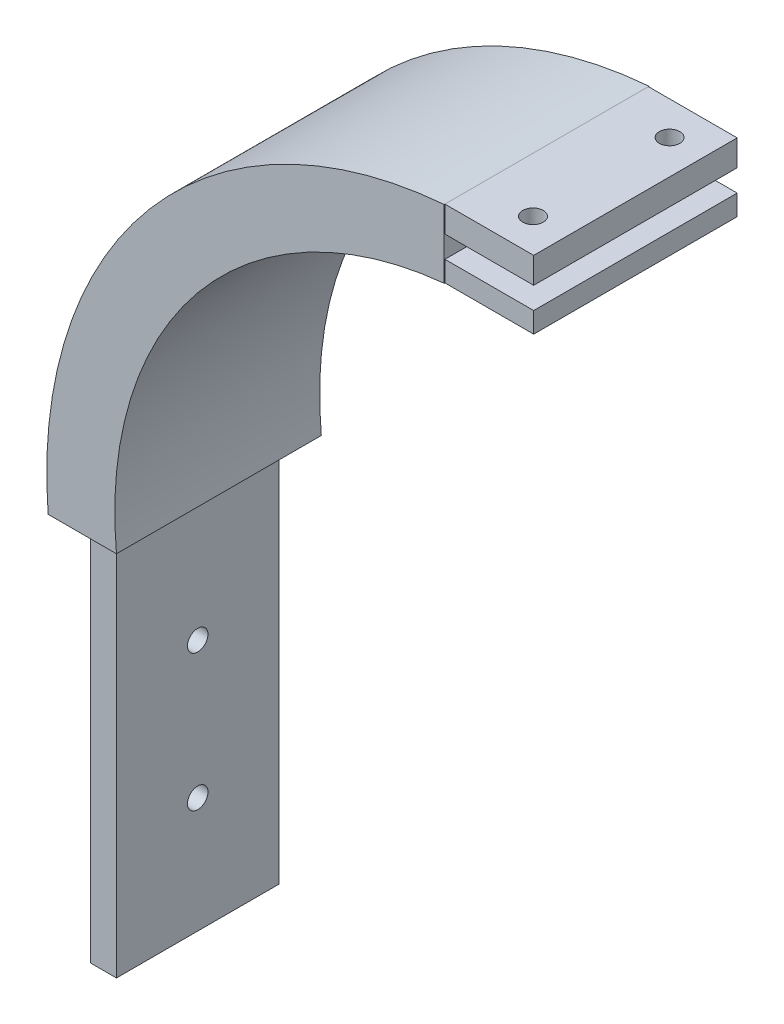
ISO-10303-21;
HEADER;
FILE_DESCRIPTION(('STEP AP214'),'2;1');
FILE_NAME('part.step','',(''),(''),'','','');
FILE_SCHEMA(('AUTOMOTIVE_DESIGN { 1 0 10303 214 1 1 1 1 }'));
ENDSEC;
DATA;
#1=APPLICATION_CONTEXT('core data for automotive mechanical design processes');
#2=APPLICATION_PROTOCOL_DEFINITION('international standard','automotive_design',2000,#1);
#3=PRODUCT_CONTEXT('',#1,'mechanical');
#4=PRODUCT('Part','Part','',(#3));
#5=PRODUCT_RELATED_PRODUCT_CATEGORY('part','',(#4));
#6=PRODUCT_DEFINITION_FORMATION('','',#4);
#7=PRODUCT_DEFINITION_CONTEXT('part definition',#1,'design');
#8=PRODUCT_DEFINITION('design','',#6,#7);
#9=PRODUCT_DEFINITION_SHAPE('','',#8);
#10=(LENGTH_UNIT() NAMED_UNIT(*) SI_UNIT(.MILLI.,.METRE.));
#11=(NAMED_UNIT(*) PLANE_ANGLE_UNIT() SI_UNIT($,.RADIAN.));
#12=(NAMED_UNIT(*) SI_UNIT($,.STERADIAN.) SOLID_ANGLE_UNIT());
#13=UNCERTAINTY_MEASURE_WITH_UNIT(LENGTH_MEASURE(1.E-05),#10,'distance_accuracy_value','');
#14=(GEOMETRIC_REPRESENTATION_CONTEXT(3) GLOBAL_UNCERTAINTY_ASSIGNED_CONTEXT((#13)) GLOBAL_UNIT_ASSIGNED_CONTEXT((#10,
#11,#12)) REPRESENTATION_CONTEXT('',''));
#15=CARTESIAN_POINT('',(0.,0.,0.));
#16=DIRECTION('',(0.,0.,1.));
#17=DIRECTION('',(1.,0.,0.));
#18=AXIS2_PLACEMENT_3D('',#15,#16,#17);
#19=CARTESIAN_POINT('',(48.,58.3,15.));
#20=DIRECTION('',(-1.,0.,0.));
#21=DIRECTION('',(0.,0.,1.));
#22=AXIS2_PLACEMENT_3D('',#19,#20,#21);
#23=PLANE('',#22);
#24=DIRECTION('',(0.,0.,-1.));
#25=VECTOR('',#24,1.);
#26=CARTESIAN_POINT('',(48.,64.5,15.));
#27=LINE('',#26,#25);
#28=CARTESIAN_POINT('',(48.,64.5,14.9));
#29=VERTEX_POINT('',#28);
#30=CARTESIAN_POINT('',(48.,64.5,-14.9));
#31=VERTEX_POINT('',#30);
#32=EDGE_CURVE('E219',#29,#31,#27,.T.);
#33=ORIENTED_EDGE('',*,*,#32,.F.);
#34=DIRECTION('',(0.,1.,0.));
#35=VECTOR('',#34,1.);
#36=CARTESIAN_POINT('',(48.,58.3000000000001,14.9));
#37=LINE('',#36,#35);
#38=CARTESIAN_POINT('',(48.,68.3000000000001,14.9));
#39=VERTEX_POINT('',#38);
#40=EDGE_CURVE('E505',#29,#39,#37,.T.);
#41=ORIENTED_EDGE('',*,*,#40,.T.);
#42=DIRECTION('',(0.,0.,-1.));
#43=VECTOR('',#42,1.);
#44=CARTESIAN_POINT('',(48.,68.3,15.));
#45=LINE('',#44,#43);
#46=CARTESIAN_POINT('',(48.,68.3000000000001,15.));
#47=VERTEX_POINT('',#46);
#48=EDGE_CURVE('E159',#47,#39,#45,.T.);
#49=ORIENTED_EDGE('',*,*,#48,.F.);
#50=DIRECTION('',(0.,1.,0.));
#51=VECTOR('',#50,1.);
#52=CARTESIAN_POINT('',(48.,58.3,15.));
#53=LINE('',#52,#51);
#54=CARTESIAN_POINT('',(48.,58.3,15.));
#55=VERTEX_POINT('',#54);
#56=EDGE_CURVE('E152',#55,#47,#53,.T.);
#57=ORIENTED_EDGE('',*,*,#56,.F.);
#58=DIRECTION('',(0.,0.,-1.));
#59=VECTOR('',#58,1.);
#60=CARTESIAN_POINT('',(48.,58.3,15.));
#61=LINE('',#60,#59);
#62=CARTESIAN_POINT('',(48.,58.3,14.9));
#63=VERTEX_POINT('',#62);
#64=EDGE_CURVE('E47',#55,#63,#61,.T.);
#65=ORIENTED_EDGE('',*,*,#64,.T.);
#66=CARTESIAN_POINT('',(48.,61.3,14.9));
#67=VERTEX_POINT('',#66);
#68=EDGE_CURVE('E507',#63,#67,#37,.T.);
#69=ORIENTED_EDGE('',*,*,#68,.T.);
#70=DIRECTION('',(0.,0.,1.));
#71=VECTOR('',#70,1.);
#72=CARTESIAN_POINT('',(48.,61.3,15.));
#73=LINE('',#72,#71);
#74=CARTESIAN_POINT('',(48.,61.3,-14.9));
#75=VERTEX_POINT('',#74);
#76=EDGE_CURVE('E201',#75,#67,#73,.T.);
#77=ORIENTED_EDGE('',*,*,#76,.F.);
#78=DIRECTION('',(0.,-1.,0.));
#79=VECTOR('',#78,1.);
#80=CARTESIAN_POINT('',(48.,58.3,-14.9));
#81=LINE('',#80,#79);
#82=CARTESIAN_POINT('',(48.,58.3,-14.9));
#83=VERTEX_POINT('',#82);
#84=EDGE_CURVE('E336',#75,#83,#81,.T.);
#85=ORIENTED_EDGE('',*,*,#84,.T.);
#86=DIRECTION('',(0.,0.,-1.));
#87=VECTOR('',#86,1.);
#88=CARTESIAN_POINT('',(48.,58.3,-15.));
#89=LINE('',#88,#87);
#90=CARTESIAN_POINT('',(48.,58.3,-15.));
#91=VERTEX_POINT('',#90);
#92=EDGE_CURVE('E334',#83,#91,#89,.T.);
#93=ORIENTED_EDGE('',*,*,#92,.T.);
#94=DIRECTION('',(0.,1.,0.));
#95=VECTOR('',#94,1.);
#96=CARTESIAN_POINT('',(48.,58.3,-15.));
#97=LINE('',#96,#95);
#98=CARTESIAN_POINT('',(48.,68.3000000000001,-15.));
#99=VERTEX_POINT('',#98);
#100=EDGE_CURVE('E303',#91,#99,#97,.T.);
#101=ORIENTED_EDGE('',*,*,#100,.T.);
#102=DIRECTION('',(0.,0.,1.));
#103=VECTOR('',#102,1.);
#104=CARTESIAN_POINT('',(48.,68.3000000000001,-14.9));
#105=LINE('',#104,#103);
#106=CARTESIAN_POINT('',(48.,68.3000000000001,-14.9));
#107=VERTEX_POINT('',#106);
#108=EDGE_CURVE('E339',#99,#107,#105,.T.);
#109=ORIENTED_EDGE('',*,*,#108,.T.);
#110=EDGE_CURVE('E346',#107,#31,#81,.T.);
#111=ORIENTED_EDGE('',*,*,#110,.T.);
#112=EDGE_LOOP('',(#33,#41,#49,#57,#65,#69,#77,#85,#93,#101,#109,#111));
#113=FACE_BOUND('',#112,.T.);
#114=ADVANCED_FACE('F38',(#113),#23,.F.);
#115=CARTESIAN_POINT('',(-10.,0.,15.));
#116=DIRECTION('',(0.,1.,0.));
#117=DIRECTION('',(0.,0.,1.));
#118=AXIS2_PLACEMENT_3D('',#115,#116,#117);
#119=PLANE('',#118);
#120=DIRECTION('',(1.,0.,0.));
#121=VECTOR('',#120,1.);
#122=CARTESIAN_POINT('',(-10.,0.,-15.));
#123=LINE('',#122,#121);
#124=CARTESIAN_POINT('',(-10.,0.,-15.));
#125=VERTEX_POINT('',#124);
#126=CARTESIAN_POINT('',(0.,0.,-15.));
#127=VERTEX_POINT('',#126);
#128=EDGE_CURVE('E174',#125,#127,#123,.T.);
#129=ORIENTED_EDGE('',*,*,#128,.T.);
#130=DIRECTION('',(0.,0.,-1.));
#131=VECTOR('',#130,1.);
#132=CARTESIAN_POINT('',(0.,0.,15.));
#133=LINE('',#132,#131);
#134=CARTESIAN_POINT('',(0.,0.,15.));
#135=VERTEX_POINT('',#134);
#136=EDGE_CURVE('E300',#135,#127,#133,.T.);
#137=ORIENTED_EDGE('',*,*,#136,.F.);
#138=DIRECTION('',(1.,0.,0.));
#139=VECTOR('',#138,1.);
#140=CARTESIAN_POINT('',(-10.,0.,15.));
#141=LINE('',#140,#139);
#142=CARTESIAN_POINT('',(-10.,0.,15.));
#143=VERTEX_POINT('',#142);
#144=EDGE_CURVE('E169',#143,#135,#141,.T.);
#145=ORIENTED_EDGE('',*,*,#144,.F.);
#146=DIRECTION('',(0.,0.,-1.));
#147=VECTOR('',#146,1.);
#148=CARTESIAN_POINT('',(-10.,0.,15.));
#149=LINE('',#148,#147);
#150=EDGE_CURVE('E312',#143,#125,#149,.T.);
#151=ORIENTED_EDGE('',*,*,#150,.T.);
#152=EDGE_LOOP('',(#129,#137,#145,#151));
#153=FACE_BOUND('',#152,.T.);
#154=DIRECTION('',(-1.,0.,0.));
#155=VECTOR('',#154,1.);
#156=CARTESIAN_POINT('',(-3.1,0.,11.9));
#157=LINE('',#156,#155);
#158=CARTESIAN_POINT('',(-3.1,0.,11.9));
#159=VERTEX_POINT('',#158);
#160=CARTESIAN_POINT('',(-6.9,0.,11.9));
#161=VERTEX_POINT('',#160);
#162=EDGE_CURVE('E244',#159,#161,#157,.T.);
#163=ORIENTED_EDGE('',*,*,#162,.F.);
#164=DIRECTION('',(0.,0.,1.));
#165=VECTOR('',#164,1.);
#166=CARTESIAN_POINT('',(-3.1,0.,-11.9));
#167=LINE('',#166,#165);
#168=CARTESIAN_POINT('',(-3.1,0.,-11.9));
#169=VERTEX_POINT('',#168);
#170=EDGE_CURVE('E256',#169,#159,#167,.T.);
#171=ORIENTED_EDGE('',*,*,#170,.F.);
#172=DIRECTION('',(1.,0.,0.));
#173=VECTOR('',#172,1.);
#174=CARTESIAN_POINT('',(-6.9,0.,-11.9));
#175=LINE('',#174,#173);
#176=CARTESIAN_POINT('',(-6.9,0.,-11.9));
#177=VERTEX_POINT('',#176);
#178=EDGE_CURVE('E273',#177,#169,#175,.T.);
#179=ORIENTED_EDGE('',*,*,#178,.F.);
#180=DIRECTION('',(0.,0.,-1.));
#181=VECTOR('',#180,1.);
#182=CARTESIAN_POINT('',(-6.9,0.,11.9));
#183=LINE('',#182,#181);
#184=EDGE_CURVE('E269',#161,#177,#183,.T.);
#185=ORIENTED_EDGE('',*,*,#184,.F.);
#186=EDGE_LOOP('',(#163,#171,#179,#185));
#187=FACE_BOUND('',#186,.T.);
#188=ADVANCED_FACE('F327',(#153,#187),#119,.F.);
#189=CARTESIAN_POINT('',(53.1499999999998,5.15000000000019,15.));
#190=DIRECTION('',(0.,0.,-1.));
#191=DIRECTION('',(-1.,0.,0.));
#192=AXIS2_PLACEMENT_3D('',#189,#190,#191);
#193=CYLINDRICAL_SURFACE('',#192,53.398923210117);
#194=CARTESIAN_POINT('',(53.1499999999998,5.15000000000019,-15.));
#195=DIRECTION('',(0.,0.,-1.));
#196=DIRECTION('',(-1.,0.,0.));
#197=AXIS2_PLACEMENT_3D('',#194,#195,#196);
#198=CIRCLE('',#197,53.398923210117);
#199=EDGE_CURVE('E294',#127,#91,#198,.T.);
#200=ORIENTED_EDGE('',*,*,#199,.T.);
#201=ORIENTED_EDGE('',*,*,#92,.F.);
#202=EDGE_CURVE('E180',#63,#83,#61,.T.);
#203=ORIENTED_EDGE('',*,*,#202,.F.);
#204=ORIENTED_EDGE('',*,*,#64,.F.);
#205=CARTESIAN_POINT('',(53.1499999999998,5.15000000000019,15.));
#206=DIRECTION('',(0.,0.,-1.));
#207=DIRECTION('',(-1.,0.,0.));
#208=AXIS2_PLACEMENT_3D('',#205,#206,#207);
#209=CIRCLE('',#208,53.398923210117);
#210=EDGE_CURVE('E164',#135,#55,#209,.T.);
#211=ORIENTED_EDGE('',*,*,#210,.F.);
#212=ORIENTED_EDGE('',*,*,#136,.T.);
#213=EDGE_LOOP('',(#200,#201,#203,#204,#211,#212));
#214=FACE_BOUND('',#213,.T.);
#215=ADVANCED_FACE('F40',(#214),#193,.F.);
#216=CARTESIAN_POINT('',(53.1499999999998,5.15000000000019,15.));
#217=DIRECTION('',(0.,0.,-1.));
#218=DIRECTION('',(-1.,0.,0.));
#219=AXIS2_PLACEMENT_3D('',#216,#217,#218);
#220=CYLINDRICAL_SURFACE('',#219,63.3596480419515);
#221=CARTESIAN_POINT('',(53.1499999999998,5.15000000000019,-15.));
#222=DIRECTION('',(0.,0.,1.));
#223=DIRECTION('',(1.,0.,0.));
#224=AXIS2_PLACEMENT_3D('',#221,#222,#223);
#225=CIRCLE('',#224,63.3596480419515);
#226=EDGE_CURVE('E306',#99,#125,#225,.T.);
#227=ORIENTED_EDGE('',*,*,#226,.T.);
#228=ORIENTED_EDGE('',*,*,#150,.F.);
#229=CARTESIAN_POINT('',(53.1499999999998,5.15000000000019,15.));
#230=DIRECTION('',(0.,0.,1.));
#231=DIRECTION('',(1.,0.,0.));
#232=AXIS2_PLACEMENT_3D('',#229,#230,#231);
#233=CIRCLE('',#232,63.3596480419515);
#234=EDGE_CURVE('E163',#47,#143,#233,.T.);
#235=ORIENTED_EDGE('',*,*,#234,.F.);
#236=ORIENTED_EDGE('',*,*,#48,.T.);
#237=EDGE_CURVE('E315',#39,#107,#45,.T.);
#238=ORIENTED_EDGE('',*,*,#237,.T.);
#239=ORIENTED_EDGE('',*,*,#108,.F.);
#240=EDGE_LOOP('',(#227,#228,#235,#236,#238,#239));
#241=FACE_BOUND('',#240,.T.);
#242=ADVANCED_FACE('F325',(#241),#220,.T.);
#243=CARTESIAN_POINT('',(53.1499999999998,5.15000000000019,15.));
#244=DIRECTION('',(0.,0.,-1.));
#245=DIRECTION('',(-1.,0.,0.));
#246=AXIS2_PLACEMENT_3D('',#243,#244,#245);
#247=PLANE('',#246);
#248=ORIENTED_EDGE('',*,*,#210,.T.);
#249=ORIENTED_EDGE('',*,*,#56,.T.);
#250=ORIENTED_EDGE('',*,*,#234,.T.);
#251=ORIENTED_EDGE('',*,*,#144,.T.);
#252=EDGE_LOOP('',(#248,#249,#250,#251));
#253=FACE_BOUND('',#252,.T.);
#254=ADVANCED_FACE('F167',(#253),#247,.F.);
#255=CARTESIAN_POINT('',(53.1499999999998,5.15000000000019,-15.));
#256=DIRECTION('',(0.,0.,-1.));
#257=DIRECTION('',(-1.,0.,0.));
#258=AXIS2_PLACEMENT_3D('',#255,#256,#257);
#259=PLANE('',#258);
#260=ORIENTED_EDGE('',*,*,#100,.F.);
#261=ORIENTED_EDGE('',*,*,#199,.F.);
#262=ORIENTED_EDGE('',*,*,#128,.F.);
#263=ORIENTED_EDGE('',*,*,#226,.F.);
#264=EDGE_LOOP('',(#260,#261,#262,#263));
#265=FACE_BOUND('',#264,.T.);
#266=ADVANCED_FACE('F331',(#265),#259,.T.);
#267=CARTESIAN_POINT('',(-3.1,-56.9,11.9));
#268=DIRECTION('',(0.,0.,-1.));
#269=DIRECTION('',(-1.,0.,0.));
#270=AXIS2_PLACEMENT_3D('',#267,#268,#269);
#271=PLANE('',#270);
#272=ORIENTED_EDGE('',*,*,#162,.T.);
#273=DIRECTION('',(0.,1.,0.));
#274=VECTOR('',#273,1.);
#275=CARTESIAN_POINT('',(-6.9,-56.9,11.9));
#276=LINE('',#275,#274);
#277=CARTESIAN_POINT('',(-6.9,-56.9,11.9));
#278=VERTEX_POINT('',#277);
#279=EDGE_CURVE('E291',#278,#161,#276,.T.);
#280=ORIENTED_EDGE('',*,*,#279,.F.);
#281=DIRECTION('',(-1.,0.,0.));
#282=VECTOR('',#281,1.);
#283=CARTESIAN_POINT('',(-3.1,-56.9,11.9));
#284=LINE('',#283,#282);
#285=CARTESIAN_POINT('',(-3.1,-56.9,11.9));
#286=VERTEX_POINT('',#285);
#287=EDGE_CURVE('E251',#286,#278,#284,.T.);
#288=ORIENTED_EDGE('',*,*,#287,.F.);
#289=DIRECTION('',(0.,1.,0.));
#290=VECTOR('',#289,1.);
#291=CARTESIAN_POINT('',(-3.1,-56.9,11.9));
#292=LINE('',#291,#290);
#293=EDGE_CURVE('E265',#286,#159,#292,.T.);
#294=ORIENTED_EDGE('',*,*,#293,.T.);
#295=EDGE_LOOP('',(#272,#280,#288,#294));
#296=FACE_BOUND('',#295,.T.);
#297=ADVANCED_FACE('F436',(#296),#271,.F.);
#298=CARTESIAN_POINT('',(-6.9,-56.9,11.9));
#299=DIRECTION('',(1.,0.,0.));
#300=DIRECTION('',(0.,0.,-1.));
#301=AXIS2_PLACEMENT_3D('',#298,#299,#300);
#302=PLANE('',#301);
#303=CARTESIAN_POINT('',(-6.9,-20.,0.));
#304=DIRECTION('',(-1.,0.,0.));
#305=DIRECTION('',(0.,0.,1.));
#306=AXIS2_PLACEMENT_3D('',#303,#304,#305);
#307=CIRCLE('',#306,1.5);
#308=CARTESIAN_POINT('',(-6.9,-20.,1.5));
#309=VERTEX_POINT('',#308);
#310=EDGE_CURVE('E235',#309,#309,#307,.T.);
#311=ORIENTED_EDGE('',*,*,#310,.F.);
#312=EDGE_LOOP('',(#311));
#313=FACE_BOUND('',#312,.T.);
#314=CARTESIAN_POINT('',(-6.9,-40.,0.));
#315=DIRECTION('',(-1.,0.,0.));
#316=DIRECTION('',(0.,0.,1.));
#317=AXIS2_PLACEMENT_3D('',#314,#315,#316);
#318=CIRCLE('',#317,1.5);
#319=CARTESIAN_POINT('',(-6.9,-40.,1.5));
#320=VERTEX_POINT('',#319);
#321=EDGE_CURVE('E231',#320,#320,#318,.T.);
#322=ORIENTED_EDGE('',*,*,#321,.F.);
#323=EDGE_LOOP('',(#322));
#324=FACE_BOUND('',#323,.T.);
#325=ORIENTED_EDGE('',*,*,#184,.T.);
#326=DIRECTION('',(0.,1.,0.));
#327=VECTOR('',#326,1.);
#328=CARTESIAN_POINT('',(-6.9,-56.9,-11.9));
#329=LINE('',#328,#327);
#330=CARTESIAN_POINT('',(-6.9,-56.9,-11.9));
#331=VERTEX_POINT('',#330);
#332=EDGE_CURVE('E287',#331,#177,#329,.T.);
#333=ORIENTED_EDGE('',*,*,#332,.F.);
#334=DIRECTION('',(0.,0.,-1.));
#335=VECTOR('',#334,1.);
#336=CARTESIAN_POINT('',(-6.9,-56.9,11.9));
#337=LINE('',#336,#335);
#338=EDGE_CURVE('E255',#278,#331,#337,.T.);
#339=ORIENTED_EDGE('',*,*,#338,.F.);
#340=ORIENTED_EDGE('',*,*,#279,.T.);
#341=EDGE_LOOP('',(#325,#333,#339,#340));
#342=FACE_BOUND('',#341,.T.);
#343=ADVANCED_FACE('F441',(#313,#324,#342),#302,.F.);
#344=CARTESIAN_POINT('',(-6.9,-56.9,-11.9));
#345=DIRECTION('',(0.,0.,1.));
#346=DIRECTION('',(1.,0.,0.));
#347=AXIS2_PLACEMENT_3D('',#344,#345,#346);
#348=PLANE('',#347);
#349=ORIENTED_EDGE('',*,*,#178,.T.);
#350=DIRECTION('',(0.,1.,0.));
#351=VECTOR('',#350,1.);
#352=CARTESIAN_POINT('',(-3.1,-56.9,-11.9));
#353=LINE('',#352,#351);
#354=CARTESIAN_POINT('',(-3.1,-56.9,-11.9));
#355=VERTEX_POINT('',#354);
#356=EDGE_CURVE('E283',#355,#169,#353,.T.);
#357=ORIENTED_EDGE('',*,*,#356,.F.);
#358=DIRECTION('',(1.,0.,0.));
#359=VECTOR('',#358,1.);
#360=CARTESIAN_POINT('',(-6.9,-56.9,-11.9));
#361=LINE('',#360,#359);
#362=EDGE_CURVE('E259',#331,#355,#361,.T.);
#363=ORIENTED_EDGE('',*,*,#362,.F.);
#364=ORIENTED_EDGE('',*,*,#332,.T.);
#365=EDGE_LOOP('',(#349,#357,#363,#364));
#366=FACE_BOUND('',#365,.T.);
#367=ADVANCED_FACE('F445',(#366),#348,.F.);
#368=CARTESIAN_POINT('',(-3.1,-56.9,-11.9));
#369=DIRECTION('',(-1.,0.,0.));
#370=DIRECTION('',(0.,0.,1.));
#371=AXIS2_PLACEMENT_3D('',#368,#369,#370);
#372=PLANE('',#371);
#373=CARTESIAN_POINT('',(-3.1,-20.,0.));
#374=DIRECTION('',(-1.,0.,0.));
#375=DIRECTION('',(0.,0.,1.));
#376=AXIS2_PLACEMENT_3D('',#373,#374,#375);
#377=CIRCLE('',#376,1.5);
#378=CARTESIAN_POINT('',(-3.1,-20.,1.5));
#379=VERTEX_POINT('',#378);
#380=EDGE_CURVE('E239',#379,#379,#377,.F.);
#381=ORIENTED_EDGE('',*,*,#380,.F.);
#382=EDGE_LOOP('',(#381));
#383=FACE_BOUND('',#382,.T.);
#384=CARTESIAN_POINT('',(-3.1,-40.,0.));
#385=DIRECTION('',(-1.,0.,0.));
#386=DIRECTION('',(0.,0.,1.));
#387=AXIS2_PLACEMENT_3D('',#384,#385,#386);
#388=CIRCLE('',#387,1.5);
#389=CARTESIAN_POINT('',(-3.1,-40.,1.5));
#390=VERTEX_POINT('',#389);
#391=EDGE_CURVE('E240',#390,#390,#388,.F.);
#392=ORIENTED_EDGE('',*,*,#391,.F.);
#393=EDGE_LOOP('',(#392));
#394=FACE_BOUND('',#393,.T.);
#395=ORIENTED_EDGE('',*,*,#170,.T.);
#396=ORIENTED_EDGE('',*,*,#293,.F.);
#397=DIRECTION('',(0.,0.,1.));
#398=VECTOR('',#397,1.);
#399=CARTESIAN_POINT('',(-3.1,-56.9,-11.9));
#400=LINE('',#399,#398);
#401=EDGE_CURVE('E262',#355,#286,#400,.T.);
#402=ORIENTED_EDGE('',*,*,#401,.F.);
#403=ORIENTED_EDGE('',*,*,#356,.T.);
#404=EDGE_LOOP('',(#395,#396,#402,#403));
#405=FACE_BOUND('',#404,.T.);
#406=ADVANCED_FACE('F449',(#383,#394,#405),#372,.F.);
#407=CARTESIAN_POINT('',(0.,-56.9,0.));
#408=DIRECTION('',(0.,-1.,0.));
#409=DIRECTION('',(0.,0.,-1.));
#410=AXIS2_PLACEMENT_3D('',#407,#408,#409);
#411=PLANE('',#410);
#412=ORIENTED_EDGE('',*,*,#287,.T.);
#413=ORIENTED_EDGE('',*,*,#338,.T.);
#414=ORIENTED_EDGE('',*,*,#362,.T.);
#415=ORIENTED_EDGE('',*,*,#401,.T.);
#416=EDGE_LOOP('',(#412,#413,#414,#415));
#417=FACE_BOUND('',#416,.T.);
#418=ADVANCED_FACE('F453',(#417),#411,.T.);
#419=CARTESIAN_POINT('',(1.14264068711929,-40.,0.));
#420=DIRECTION('',(-1.,0.,0.));
#421=DIRECTION('',(0.,0.,1.));
#422=AXIS2_PLACEMENT_3D('',#419,#420,#421);
#423=CYLINDRICAL_SURFACE('',#422,1.5);
#424=ORIENTED_EDGE('',*,*,#391,.T.);
#425=EDGE_LOOP('',(#424));
#426=FACE_BOUND('',#425,.T.);
#427=ORIENTED_EDGE('',*,*,#321,.T.);
#428=EDGE_LOOP('',(#427));
#429=FACE_BOUND('',#428,.T.);
#430=ADVANCED_FACE('F457',(#426,#429),#423,.F.);
#431=CARTESIAN_POINT('',(1.14264068711929,-20.,0.));
#432=DIRECTION('',(-1.,0.,0.));
#433=DIRECTION('',(0.,0.,1.));
#434=AXIS2_PLACEMENT_3D('',#431,#432,#433);
#435=CYLINDRICAL_SURFACE('',#434,1.5);
#436=ORIENTED_EDGE('',*,*,#380,.T.);
#437=EDGE_LOOP('',(#436));
#438=FACE_BOUND('',#437,.T.);
#439=ORIENTED_EDGE('',*,*,#310,.T.);
#440=EDGE_LOOP('',(#439));
#441=FACE_BOUND('',#440,.T.);
#442=ADVANCED_FACE('F390',(#438,#441),#435,.F.);
#443=CARTESIAN_POINT('',(61.,68.3,-15.));
#444=DIRECTION('',(0.,-1.,0.));
#445=DIRECTION('',(1.,0.,0.));
#446=AXIS2_PLACEMENT_3D('',#443,#444,#445);
#447=PLANE('',#446);
#448=CARTESIAN_POINT('',(56.,68.3,10.));
#449=DIRECTION('',(0.,-1.,0.));
#450=DIRECTION('',(1.,0.,0.));
#451=AXIS2_PLACEMENT_3D('',#448,#449,#450);
#452=CIRCLE('',#451,1.5);
#453=CARTESIAN_POINT('',(57.5,68.3,10.));
#454=VERTEX_POINT('',#453);
#455=EDGE_CURVE('E191',#454,#454,#452,.F.);
#456=ORIENTED_EDGE('',*,*,#455,.F.);
#457=EDGE_LOOP('',(#456));
#458=FACE_BOUND('',#457,.T.);
#459=CARTESIAN_POINT('',(56.0000000000001,68.3,-10.));
#460=DIRECTION('',(0.,-1.,0.));
#461=DIRECTION('',(1.,0.,0.));
#462=AXIS2_PLACEMENT_3D('',#459,#460,#461);
#463=CIRCLE('',#462,1.5);
#464=CARTESIAN_POINT('',(57.5000000000001,68.3,-10.));
#465=VERTEX_POINT('',#464);
#466=EDGE_CURVE('E208',#465,#465,#463,.F.);
#467=ORIENTED_EDGE('',*,*,#466,.F.);
#468=EDGE_LOOP('',(#467));
#469=FACE_BOUND('',#468,.T.);
#470=ORIENTED_EDGE('',*,*,#237,.F.);
#471=DIRECTION('',(1.,0.,0.));
#472=VECTOR('',#471,1.);
#473=CARTESIAN_POINT('',(37.9995000124993,68.3000000000001,14.9));
#474=LINE('',#473,#472);
#475=CARTESIAN_POINT('',(61.,68.3,14.9));
#476=VERTEX_POINT('',#475);
#477=EDGE_CURVE('E358',#39,#476,#474,.T.);
#478=ORIENTED_EDGE('',*,*,#477,.T.);
#479=DIRECTION('',(0.,0.,1.));
#480=VECTOR('',#479,1.);
#481=CARTESIAN_POINT('',(61.,68.3,-15.));
#482=LINE('',#481,#480);
#483=CARTESIAN_POINT('',(61.,68.3,-14.9));
#484=VERTEX_POINT('',#483);
#485=EDGE_CURVE('E223',#484,#476,#482,.T.);
#486=ORIENTED_EDGE('',*,*,#485,.F.);
#487=DIRECTION('',(1.,0.,0.));
#488=VECTOR('',#487,1.);
#489=CARTESIAN_POINT('',(37.9995000124993,68.3000000000001,-14.9));
#490=LINE('',#489,#488);
#491=EDGE_CURVE('E62',#107,#484,#490,.T.);
#492=ORIENTED_EDGE('',*,*,#491,.F.);
#493=EDGE_LOOP('',(#470,#478,#486,#492));
#494=FACE_BOUND('',#493,.T.);
#495=ADVANCED_FACE('F386',(#458,#469,#494),#447,.F.);
#496=CARTESIAN_POINT('',(61.,64.5,15.));
#497=DIRECTION('',(0.,1.,0.));
#498=DIRECTION('',(-1.,0.,0.));
#499=AXIS2_PLACEMENT_3D('',#496,#497,#498);
#500=PLANE('',#499);
#501=CARTESIAN_POINT('',(56.,64.5,10.));
#502=DIRECTION('',(0.,1.,0.));
#503=DIRECTION('',(-1.,0.,0.));
#504=AXIS2_PLACEMENT_3D('',#501,#502,#503);
#505=CIRCLE('',#504,1.5);
#506=CARTESIAN_POINT('',(57.5,64.5,10.));
#507=VERTEX_POINT('',#506);
#508=EDGE_CURVE('E195',#507,#507,#505,.T.);
#509=ORIENTED_EDGE('',*,*,#508,.T.);
#510=EDGE_LOOP('',(#509));
#511=FACE_BOUND('',#510,.T.);
#512=CARTESIAN_POINT('',(56.,64.5,-10.));
#513=DIRECTION('',(0.,1.,0.));
#514=DIRECTION('',(-1.,0.,0.));
#515=AXIS2_PLACEMENT_3D('',#512,#513,#514);
#516=CIRCLE('',#515,1.5);
#517=CARTESIAN_POINT('',(57.5,64.5,-10.));
#518=VERTEX_POINT('',#517);
#519=EDGE_CURVE('E190',#518,#518,#516,.T.);
#520=ORIENTED_EDGE('',*,*,#519,.T.);
#521=EDGE_LOOP('',(#520));
#522=FACE_BOUND('',#521,.T.);
#523=DIRECTION('',(0.,0.,-1.));
#524=VECTOR('',#523,1.);
#525=CARTESIAN_POINT('',(61.,64.5,15.));
#526=LINE('',#525,#524);
#527=CARTESIAN_POINT('',(61.,64.5,14.9));
#528=VERTEX_POINT('',#527);
#529=CARTESIAN_POINT('',(61.,64.5,-14.9));
#530=VERTEX_POINT('',#529);
#531=EDGE_CURVE('E227',#528,#530,#526,.T.);
#532=ORIENTED_EDGE('',*,*,#531,.F.);
#533=DIRECTION('',(-1.,0.,0.));
#534=VECTOR('',#533,1.);
#535=CARTESIAN_POINT('',(61.,64.5,14.9));
#536=LINE('',#535,#534);
#537=EDGE_CURVE('E54',#528,#29,#536,.T.);
#538=ORIENTED_EDGE('',*,*,#537,.T.);
#539=ORIENTED_EDGE('',*,*,#32,.T.);
#540=DIRECTION('',(1.,0.,0.));
#541=VECTOR('',#540,1.);
#542=CARTESIAN_POINT('',(61.,64.5,-14.9));
#543=LINE('',#542,#541);
#544=EDGE_CURVE('E357',#31,#530,#543,.T.);
#545=ORIENTED_EDGE('',*,*,#544,.T.);
#546=EDGE_LOOP('',(#532,#538,#539,#545));
#547=FACE_BOUND('',#546,.T.);
#548=ADVANCED_FACE('F389',(#511,#522,#547),#500,.F.);
#549=CARTESIAN_POINT('',(60.9999999999999,0.,0.));
#550=DIRECTION('',(1.,0.,0.));
#551=DIRECTION('',(0.,1.,0.));
#552=AXIS2_PLACEMENT_3D('',#549,#550,#551);
#553=PLANE('',#552);
#554=DIRECTION('',(0.,1.,0.));
#555=VECTOR('',#554,1.);
#556=CARTESIAN_POINT('',(61.,58.3,14.9));
#557=LINE('',#556,#555);
#558=EDGE_CURVE('E352',#528,#476,#557,.T.);
#559=ORIENTED_EDGE('',*,*,#558,.F.);
#560=ORIENTED_EDGE('',*,*,#531,.T.);
#561=DIRECTION('',(0.,-1.,0.));
#562=VECTOR('',#561,1.);
#563=CARTESIAN_POINT('',(61.,58.3,-14.9));
#564=LINE('',#563,#562);
#565=EDGE_CURVE('E399',#484,#530,#564,.T.);
#566=ORIENTED_EDGE('',*,*,#565,.F.);
#567=ORIENTED_EDGE('',*,*,#485,.T.);
#568=EDGE_LOOP('',(#559,#560,#566,#567));
#569=FACE_BOUND('',#568,.T.);
#570=ADVANCED_FACE('F397',(#569),#553,.T.);
#571=CARTESIAN_POINT('',(61.,58.3,-15.));
#572=DIRECTION('',(0.,1.,0.));
#573=DIRECTION('',(-1.,0.,0.));
#574=AXIS2_PLACEMENT_3D('',#571,#572,#573);
#575=PLANE('',#574);
#576=CARTESIAN_POINT('',(56.,58.3,10.));
#577=DIRECTION('',(0.,-1.,0.));
#578=DIRECTION('',(1.,0.,0.));
#579=AXIS2_PLACEMENT_3D('',#576,#577,#578);
#580=CIRCLE('',#579,1.5);
#581=CARTESIAN_POINT('',(57.5,58.3,10.));
#582=VERTEX_POINT('',#581);
#583=EDGE_CURVE('E369',#582,#582,#580,.T.);
#584=ORIENTED_EDGE('',*,*,#583,.F.);
#585=EDGE_LOOP('',(#584));
#586=FACE_BOUND('',#585,.T.);
#587=CARTESIAN_POINT('',(56.,58.3,-10.));
#588=DIRECTION('',(0.,-1.,0.));
#589=DIRECTION('',(1.,0.,0.));
#590=AXIS2_PLACEMENT_3D('',#587,#588,#589);
#591=CIRCLE('',#590,1.5);
#592=CARTESIAN_POINT('',(57.5,58.3,-10.));
#593=VERTEX_POINT('',#592);
#594=EDGE_CURVE('E368',#593,#593,#591,.T.);
#595=ORIENTED_EDGE('',*,*,#594,.F.);
#596=EDGE_LOOP('',(#595));
#597=FACE_BOUND('',#596,.T.);
#598=DIRECTION('',(0.,0.,-1.));
#599=VECTOR('',#598,1.);
#600=CARTESIAN_POINT('',(61.,58.3,-15.));
#601=LINE('',#600,#599);
#602=CARTESIAN_POINT('',(61.,58.3,14.9));
#603=VERTEX_POINT('',#602);
#604=CARTESIAN_POINT('',(61.,58.3,-14.9));
#605=VERTEX_POINT('',#604);
#606=EDGE_CURVE('E211',#603,#605,#601,.T.);
#607=ORIENTED_EDGE('',*,*,#606,.F.);
#608=DIRECTION('',(1.,0.,0.));
#609=VECTOR('',#608,1.);
#610=CARTESIAN_POINT('',(37.9995000124993,58.3000000000001,14.9));
#611=LINE('',#610,#609);
#612=EDGE_CURVE('E404',#63,#603,#611,.T.);
#613=ORIENTED_EDGE('',*,*,#612,.F.);
#614=ORIENTED_EDGE('',*,*,#202,.T.);
#615=DIRECTION('',(1.,0.,0.));
#616=VECTOR('',#615,1.);
#617=CARTESIAN_POINT('',(37.9995000124993,58.3,-14.9));
#618=LINE('',#617,#616);
#619=EDGE_CURVE('E340',#83,#605,#618,.T.);
#620=ORIENTED_EDGE('',*,*,#619,.T.);
#621=EDGE_LOOP('',(#607,#613,#614,#620));
#622=FACE_BOUND('',#621,.T.);
#623=ADVANCED_FACE('F470',(#586,#597,#622),#575,.F.);
#624=CARTESIAN_POINT('',(61.,61.3,15.));
#625=DIRECTION('',(0.,-1.,0.));
#626=DIRECTION('',(1.,0.,0.));
#627=AXIS2_PLACEMENT_3D('',#624,#625,#626);
#628=PLANE('',#627);
#629=CARTESIAN_POINT('',(56.,61.3,10.));
#630=DIRECTION('',(0.,-1.,0.));
#631=DIRECTION('',(1.,0.,0.));
#632=AXIS2_PLACEMENT_3D('',#629,#630,#631);
#633=CIRCLE('',#632,1.5);
#634=CARTESIAN_POINT('',(57.5,61.3,10.));
#635=VERTEX_POINT('',#634);
#636=EDGE_CURVE('E192',#635,#635,#633,.T.);
#637=ORIENTED_EDGE('',*,*,#636,.T.);
#638=EDGE_LOOP('',(#637));
#639=FACE_BOUND('',#638,.T.);
#640=CARTESIAN_POINT('',(56.,61.3,-10.));
#641=DIRECTION('',(0.,-1.,0.));
#642=DIRECTION('',(1.,0.,0.));
#643=AXIS2_PLACEMENT_3D('',#640,#641,#642);
#644=CIRCLE('',#643,1.5);
#645=CARTESIAN_POINT('',(57.5,61.3,-10.));
#646=VERTEX_POINT('',#645);
#647=EDGE_CURVE('E187',#646,#646,#644,.T.);
#648=ORIENTED_EDGE('',*,*,#647,.T.);
#649=EDGE_LOOP('',(#648));
#650=FACE_BOUND('',#649,.T.);
#651=ORIENTED_EDGE('',*,*,#76,.T.);
#652=DIRECTION('',(1.,0.,0.));
#653=VECTOR('',#652,1.);
#654=CARTESIAN_POINT('',(61.,61.3,14.9));
#655=LINE('',#654,#653);
#656=CARTESIAN_POINT('',(61.,61.3,14.9));
#657=VERTEX_POINT('',#656);
#658=EDGE_CURVE('E362',#67,#657,#655,.T.);
#659=ORIENTED_EDGE('',*,*,#658,.T.);
#660=DIRECTION('',(0.,0.,1.));
#661=VECTOR('',#660,1.);
#662=CARTESIAN_POINT('',(61.,61.3,15.));
#663=LINE('',#662,#661);
#664=CARTESIAN_POINT('',(61.,61.3,-14.9));
#665=VERTEX_POINT('',#664);
#666=EDGE_CURVE('E215',#665,#657,#663,.T.);
#667=ORIENTED_EDGE('',*,*,#666,.F.);
#668=DIRECTION('',(-1.,0.,0.));
#669=VECTOR('',#668,1.);
#670=CARTESIAN_POINT('',(61.,61.3,-14.9));
#671=LINE('',#670,#669);
#672=EDGE_CURVE('E353',#665,#75,#671,.T.);
#673=ORIENTED_EDGE('',*,*,#672,.T.);
#674=EDGE_LOOP('',(#651,#659,#667,#673));
#675=FACE_BOUND('',#674,.T.);
#676=ADVANCED_FACE('F473',(#639,#650,#675),#628,.F.);
#677=CARTESIAN_POINT('',(61.,0.,0.));
#678=DIRECTION('',(-1.,0.,0.));
#679=DIRECTION('',(0.,0.,1.));
#680=AXIS2_PLACEMENT_3D('',#677,#678,#679);
#681=PLANE('',#680);
#682=ORIENTED_EDGE('',*,*,#666,.T.);
#683=EDGE_CURVE('E500',#603,#657,#557,.T.);
#684=ORIENTED_EDGE('',*,*,#683,.F.);
#685=ORIENTED_EDGE('',*,*,#606,.T.);
#686=DIRECTION('',(0.,1.,0.));
#687=VECTOR('',#686,1.);
#688=CARTESIAN_POINT('',(61.,0.,-14.9));
#689=LINE('',#688,#687);
#690=EDGE_CURVE('E11',#605,#665,#689,.T.);
#691=ORIENTED_EDGE('',*,*,#690,.T.);
#692=EDGE_LOOP('',(#682,#684,#685,#691));
#693=FACE_BOUND('',#692,.T.);
#694=ADVANCED_FACE('F477',(#693),#681,.F.);
#695=CARTESIAN_POINT('',(56.0000000000001,72.5426406871193,-10.));
#696=DIRECTION('',(0.,-1.,0.));
#697=DIRECTION('',(1.,0.,0.));
#698=AXIS2_PLACEMENT_3D('',#695,#696,#697);
#699=CYLINDRICAL_SURFACE('',#698,1.5);
#700=ORIENTED_EDGE('',*,*,#594,.T.);
#701=EDGE_LOOP('',(#700));
#702=FACE_BOUND('',#701,.T.);
#703=ORIENTED_EDGE('',*,*,#647,.F.);
#704=EDGE_LOOP('',(#703));
#705=FACE_BOUND('',#704,.T.);
#706=ADVANCED_FACE('F480',(#702,#705),#699,.F.);
#707=CARTESIAN_POINT('',(56.,72.5426406871193,10.));
#708=DIRECTION('',(0.,-1.,0.));
#709=DIRECTION('',(1.,0.,0.));
#710=AXIS2_PLACEMENT_3D('',#707,#708,#709);
#711=CYLINDRICAL_SURFACE('',#710,1.5);
#712=ORIENTED_EDGE('',*,*,#583,.T.);
#713=EDGE_LOOP('',(#712));
#714=FACE_BOUND('',#713,.T.);
#715=ORIENTED_EDGE('',*,*,#636,.F.);
#716=EDGE_LOOP('',(#715));
#717=FACE_BOUND('',#716,.T.);
#718=ADVANCED_FACE('F483',(#714,#717),#711,.F.);
#719=CARTESIAN_POINT('',(57.5000000000001,68.3,-10.));
#720=CARTESIAN_POINT('',(57.5000000000001,68.2604166666667,-10.));
#721=CARTESIAN_POINT('',(57.5000000000001,68.2208333333334,-10.));
#722=CARTESIAN_POINT('',(57.5000000000001,68.1416666666667,-10.));
#723=CARTESIAN_POINT('',(57.5000000000001,68.1020833333334,-10.));
#724=CARTESIAN_POINT('',(57.5000000000001,68.0229166666667,-10.));
#725=CARTESIAN_POINT('',(57.5000000000001,67.9833333333333,-10.));
#726=CARTESIAN_POINT('',(57.5000000000001,67.9041666666667,-10.));
#727=CARTESIAN_POINT('',(57.5000000000001,67.8645833333333,-10.));
#728=CARTESIAN_POINT('',(57.5000000000001,67.7854166666667,-10.));
#729=CARTESIAN_POINT('',(57.5000000000001,67.7458333333333,-10.));
#730=CARTESIAN_POINT('',(57.5000000000001,67.6666666666667,-10.));
#731=CARTESIAN_POINT('',(57.5000000000001,67.6270833333333,-10.));
#732=CARTESIAN_POINT('',(57.5000000000001,67.5479166666667,-10.));
#733=CARTESIAN_POINT('',(57.5,67.5083333333333,-10.));
#734=CARTESIAN_POINT('',(57.5,67.4291666666667,-10.));
#735=CARTESIAN_POINT('',(57.5,67.3895833333333,-10.));
#736=CARTESIAN_POINT('',(57.5,67.3104166666667,-10.));
#737=CARTESIAN_POINT('',(57.5,67.2708333333333,-10.));
#738=CARTESIAN_POINT('',(57.5,67.1916666666667,-10.));
#739=CARTESIAN_POINT('',(57.5,67.1520833333333,-10.));
#740=CARTESIAN_POINT('',(57.5,67.0729166666667,-10.));
#741=CARTESIAN_POINT('',(57.5,67.0333333333333,-10.));
#742=CARTESIAN_POINT('',(57.5,66.9541666666667,-10.));
#743=CARTESIAN_POINT('',(57.5,66.9145833333333,-10.));
#744=CARTESIAN_POINT('',(57.5,66.8354166666667,-10.));
#745=CARTESIAN_POINT('',(57.5,66.7958333333333,-10.));
#746=CARTESIAN_POINT('',(57.5,66.7166666666667,-10.));
#747=CARTESIAN_POINT('',(57.5,66.6770833333333,-10.));
#748=CARTESIAN_POINT('',(57.5,66.5979166666667,-10.));
#749=CARTESIAN_POINT('',(57.5,66.5583333333333,-10.));
#750=CARTESIAN_POINT('',(57.5,66.4791666666667,-10.));
#751=CARTESIAN_POINT('',(57.5,66.4395833333333,-10.));
#752=CARTESIAN_POINT('',(57.5,66.3604166666667,-10.));
#753=CARTESIAN_POINT('',(57.5,66.3208333333333,-10.));
#754=CARTESIAN_POINT('',(57.5,66.2416666666667,-10.));
#755=CARTESIAN_POINT('',(57.5,66.2020833333333,-10.));
#756=CARTESIAN_POINT('',(57.5,66.1229166666667,-10.));
#757=CARTESIAN_POINT('',(57.5,66.0833333333333,-10.));
#758=CARTESIAN_POINT('',(57.5,66.0041666666667,-10.));
#759=CARTESIAN_POINT('',(57.5,65.9645833333333,-10.));
#760=CARTESIAN_POINT('',(57.5,65.8854166666667,-10.));
#761=CARTESIAN_POINT('',(57.5,65.8458333333333,-10.));
#762=CARTESIAN_POINT('',(57.5,65.7666666666667,-10.));
#763=CARTESIAN_POINT('',(57.5,65.7270833333333,-10.));
#764=CARTESIAN_POINT('',(57.5,65.6479166666667,-10.));
#765=CARTESIAN_POINT('',(57.5,65.6083333333333,-10.));
#766=CARTESIAN_POINT('',(57.5,65.5291666666667,-10.));
#767=CARTESIAN_POINT('',(57.5,65.4895833333333,-10.));
#768=CARTESIAN_POINT('',(57.5,65.4104166666667,-10.));
#769=CARTESIAN_POINT('',(57.5,65.3708333333333,-10.));
#770=CARTESIAN_POINT('',(57.5,65.2916666666667,-10.));
#771=CARTESIAN_POINT('',(57.5,65.2520833333333,-10.));
#772=CARTESIAN_POINT('',(57.5,65.1729166666667,-10.));
#773=CARTESIAN_POINT('',(57.5,65.1333333333333,-10.));
#774=CARTESIAN_POINT('',(57.5,65.0541666666667,-10.));
#775=CARTESIAN_POINT('',(57.5,65.0145833333333,-10.));
#776=CARTESIAN_POINT('',(57.5,64.9354166666667,-10.));
#777=CARTESIAN_POINT('',(57.5,64.8958333333333,-10.));
#778=CARTESIAN_POINT('',(57.5,64.8166666666667,-10.));
#779=CARTESIAN_POINT('',(57.5,64.7770833333333,-10.));
#780=CARTESIAN_POINT('',(57.5,64.6979166666666,-10.));
#781=CARTESIAN_POINT('',(57.5,64.6583333333333,-10.));
#782=CARTESIAN_POINT('',(57.5,64.5791666666667,-10.));
#783=CARTESIAN_POINT('',(57.5,64.5395833333333,-10.));
#784=CARTESIAN_POINT('',(57.5,64.5,-10.));
#785=B_SPLINE_CURVE_WITH_KNOTS('',3,(#719,#720,#721,#722,#723,#724,#725,#726,#727,#728,#729,
#730,#731,#732,#733,#734,#735,#736,#737,#738,#739,#740,#741,#742,#743,#744,#745,#746,#747,#748,
#749,#750,#751,#752,#753,#754,#755,#756,#757,#758,#759,#760,#761,#762,#763,#764,#765,#766,#767,
#768,#769,#770,#771,#772,#773,#774,#775,#776,#777,#778,#779,#780,#781,#782,#783,#784),
.UNSPECIFIED.,.F.,.F.,(4,2,2,2,2,2,2,2,2,2,2,2,2,2,2,2,2,2,2,2,2,2,2,2,2,2,2,2,2,2,2,2,4),(0.,
0.118750000000001,0.237500000000015,0.356250000000016,0.475000000000017,0.593750000000018,
0.712500000000019,0.831250000000019,0.95000000000002,1.06875000000002,1.18750000000002,
1.30625000000002,1.42500000000002,1.54375000000002,1.66250000000002,1.78125000000003,
1.90000000000003,2.01875000000003,2.13750000000003,2.25625000000003,2.37500000000003,
2.49375000000003,2.61250000000003,2.73125000000003,2.85000000000003,2.96875000000003,
3.08750000000003,3.20625000000004,3.32500000000004,3.44375000000004,3.56250000000004,
3.68125000000005,3.80000000000005),.UNSPECIFIED.);
#786=EDGE_CURVE('BSEAM383',#465,#518,#785,.T.);
#787=ORIENTED_EDGE('',*,*,#466,.T.);
#788=ORIENTED_EDGE('',*,*,#519,.F.);
#789=ORIENTED_EDGE('',*,*,#786,.T.);
#790=ORIENTED_EDGE('',*,*,#786,.F.);
#791=EDGE_LOOP('',(#787,#789,#788,#790));
#792=FACE_BOUND('',#791,.T.);
#793=ADVANCED_FACE('F383',(#792),#699,.F.);
#794=CARTESIAN_POINT('',(57.5,68.3,10.));
#795=CARTESIAN_POINT('',(57.5,68.2604166666667,10.));
#796=CARTESIAN_POINT('',(57.5,68.2208333333334,10.));
#797=CARTESIAN_POINT('',(57.5,68.1416666666667,10.));
#798=CARTESIAN_POINT('',(57.5,68.1020833333334,10.));
#799=CARTESIAN_POINT('',(57.5,68.0229166666667,10.));
#800=CARTESIAN_POINT('',(57.5,67.9833333333333,10.));
#801=CARTESIAN_POINT('',(57.5,67.9041666666667,10.));
#802=CARTESIAN_POINT('',(57.5,67.8645833333333,10.));
#803=CARTESIAN_POINT('',(57.5,67.7854166666667,10.));
#804=CARTESIAN_POINT('',(57.5,67.7458333333333,10.));
#805=CARTESIAN_POINT('',(57.5,67.6666666666667,10.));
#806=CARTESIAN_POINT('',(57.5,67.6270833333333,10.));
#807=CARTESIAN_POINT('',(57.5,67.5479166666667,10.));
#808=CARTESIAN_POINT('',(57.5,67.5083333333333,10.));
#809=CARTESIAN_POINT('',(57.5,67.4291666666667,10.));
#810=CARTESIAN_POINT('',(57.5,67.3895833333333,10.));
#811=CARTESIAN_POINT('',(57.5,67.3104166666667,10.));
#812=CARTESIAN_POINT('',(57.5,67.2708333333333,10.));
#813=CARTESIAN_POINT('',(57.5,67.1916666666667,10.));
#814=CARTESIAN_POINT('',(57.5,67.1520833333333,10.));
#815=CARTESIAN_POINT('',(57.5,67.0729166666667,10.));
#816=CARTESIAN_POINT('',(57.5,67.0333333333333,10.));
#817=CARTESIAN_POINT('',(57.5,66.9541666666667,10.));
#818=CARTESIAN_POINT('',(57.5,66.9145833333333,10.));
#819=CARTESIAN_POINT('',(57.5,66.8354166666667,10.));
#820=CARTESIAN_POINT('',(57.5,66.7958333333333,10.));
#821=CARTESIAN_POINT('',(57.5,66.7166666666667,10.));
#822=CARTESIAN_POINT('',(57.5,66.6770833333333,10.));
#823=CARTESIAN_POINT('',(57.5,66.5979166666667,10.));
#824=CARTESIAN_POINT('',(57.5,66.5583333333333,10.));
#825=CARTESIAN_POINT('',(57.5,66.4791666666667,10.));
#826=CARTESIAN_POINT('',(57.5,66.4395833333333,10.));
#827=CARTESIAN_POINT('',(57.5,66.3604166666667,10.));
#828=CARTESIAN_POINT('',(57.5,66.3208333333333,10.));
#829=CARTESIAN_POINT('',(57.5,66.2416666666667,10.));
#830=CARTESIAN_POINT('',(57.5,66.2020833333333,10.));
#831=CARTESIAN_POINT('',(57.5,66.1229166666667,10.));
#832=CARTESIAN_POINT('',(57.5,66.0833333333333,10.));
#833=CARTESIAN_POINT('',(57.5,66.0041666666667,10.));
#834=CARTESIAN_POINT('',(57.5,65.9645833333333,10.));
#835=CARTESIAN_POINT('',(57.5,65.8854166666667,10.));
#836=CARTESIAN_POINT('',(57.5,65.8458333333333,10.));
#837=CARTESIAN_POINT('',(57.5,65.7666666666667,10.));
#838=CARTESIAN_POINT('',(57.5,65.7270833333333,10.));
#839=CARTESIAN_POINT('',(57.5,65.6479166666667,10.));
#840=CARTESIAN_POINT('',(57.5,65.6083333333333,10.));
#841=CARTESIAN_POINT('',(57.5,65.5291666666667,10.));
#842=CARTESIAN_POINT('',(57.5,65.4895833333333,10.));
#843=CARTESIAN_POINT('',(57.5,65.4104166666667,10.));
#844=CARTESIAN_POINT('',(57.5,65.3708333333333,10.));
#845=CARTESIAN_POINT('',(57.5,65.2916666666667,10.));
#846=CARTESIAN_POINT('',(57.5,65.2520833333333,10.));
#847=CARTESIAN_POINT('',(57.5,65.1729166666667,10.));
#848=CARTESIAN_POINT('',(57.5,65.1333333333333,10.));
#849=CARTESIAN_POINT('',(57.5,65.0541666666667,10.));
#850=CARTESIAN_POINT('',(57.5,65.0145833333333,10.));
#851=CARTESIAN_POINT('',(57.5,64.9354166666667,10.));
#852=CARTESIAN_POINT('',(57.5,64.8958333333333,10.));
#853=CARTESIAN_POINT('',(57.5,64.8166666666667,10.));
#854=CARTESIAN_POINT('',(57.5,64.7770833333333,10.));
#855=CARTESIAN_POINT('',(57.5,64.6979166666666,10.));
#856=CARTESIAN_POINT('',(57.5,64.6583333333333,10.));
#857=CARTESIAN_POINT('',(57.5,64.5791666666667,10.));
#858=CARTESIAN_POINT('',(57.5,64.5395833333333,10.));
#859=CARTESIAN_POINT('',(57.5,64.5,10.));
#860=B_SPLINE_CURVE_WITH_KNOTS('',3,(#794,#795,#796,#797,#798,#799,#800,#801,#802,#803,#804,
#805,#806,#807,#808,#809,#810,#811,#812,#813,#814,#815,#816,#817,#818,#819,#820,#821,#822,#823,
#824,#825,#826,#827,#828,#829,#830,#831,#832,#833,#834,#835,#836,#837,#838,#839,#840,#841,#842,
#843,#844,#845,#846,#847,#848,#849,#850,#851,#852,#853,#854,#855,#856,#857,#858,#859),
.UNSPECIFIED.,.F.,.F.,(4,2,2,2,2,2,2,2,2,2,2,2,2,2,2,2,2,2,2,2,2,2,2,2,2,2,2,2,2,2,2,2,4),(0.,
0.118750000000001,0.237500000000015,0.356250000000016,0.475000000000017,0.593750000000018,
0.712500000000019,0.831250000000019,0.95000000000002,1.06875000000002,1.18750000000002,
1.30625000000002,1.42500000000002,1.54375000000002,1.66250000000002,1.78125000000003,
1.90000000000003,2.01875000000003,2.13750000000003,2.25625000000003,2.37500000000003,
2.49375000000003,2.61250000000003,2.73125000000003,2.85000000000003,2.96875000000003,
3.08750000000003,3.20625000000004,3.32500000000004,3.44375000000004,3.56250000000004,
3.68125000000005,3.80000000000005),.UNSPECIFIED.);
#861=EDGE_CURVE('BSEAM423',#454,#507,#860,.T.);
#862=ORIENTED_EDGE('',*,*,#455,.T.);
#863=ORIENTED_EDGE('',*,*,#508,.F.);
#864=ORIENTED_EDGE('',*,*,#861,.T.);
#865=ORIENTED_EDGE('',*,*,#861,.F.);
#866=EDGE_LOOP('',(#862,#864,#863,#865));
#867=FACE_BOUND('',#866,.T.);
#868=ADVANCED_FACE('F423',(#867),#711,.F.);
#869=CARTESIAN_POINT('',(37.9995000124993,58.3,-14.9));
#870=DIRECTION('',(0.,0.,1.));
#871=DIRECTION('',(1.,0.,0.));
#872=AXIS2_PLACEMENT_3D('',#869,#870,#871);
#873=PLANE('',#872);
#874=ORIENTED_EDGE('',*,*,#690,.F.);
#875=ORIENTED_EDGE('',*,*,#619,.F.);
#876=ORIENTED_EDGE('',*,*,#84,.F.);
#877=ORIENTED_EDGE('',*,*,#672,.F.);
#878=EDGE_LOOP('',(#874,#875,#876,#877));
#879=FACE_BOUND('',#878,.T.);
#880=ADVANCED_FACE('F414',(#879),#873,.F.);
#881=CARTESIAN_POINT('',(37.9995000124993,58.3000000000001,14.9));
#882=DIRECTION('',(0.,0.,-1.));
#883=DIRECTION('',(-1.,0.,0.));
#884=AXIS2_PLACEMENT_3D('',#881,#882,#883);
#885=PLANE('',#884);
#886=ORIENTED_EDGE('',*,*,#68,.F.);
#887=ORIENTED_EDGE('',*,*,#612,.T.);
#888=ORIENTED_EDGE('',*,*,#683,.T.);
#889=ORIENTED_EDGE('',*,*,#658,.F.);
#890=EDGE_LOOP('',(#886,#887,#888,#889));
#891=FACE_BOUND('',#890,.T.);
#892=ADVANCED_FACE('F412',(#891),#885,.F.);
#893=ORIENTED_EDGE('',*,*,#110,.F.);
#894=ORIENTED_EDGE('',*,*,#491,.T.);
#895=ORIENTED_EDGE('',*,*,#565,.T.);
#896=ORIENTED_EDGE('',*,*,#544,.F.);
#897=EDGE_LOOP('',(#893,#894,#895,#896));
#898=FACE_BOUND('',#897,.T.);
#899=ADVANCED_FACE('F409',(#898),#873,.F.);
#900=ORIENTED_EDGE('',*,*,#558,.T.);
#901=ORIENTED_EDGE('',*,*,#477,.F.);
#902=ORIENTED_EDGE('',*,*,#40,.F.);
#903=ORIENTED_EDGE('',*,*,#537,.F.);
#904=EDGE_LOOP('',(#900,#901,#902,#903));
#905=FACE_BOUND('',#904,.T.);
#906=ADVANCED_FACE('F411',(#905),#885,.F.);
#907=CLOSED_SHELL('',(#114,#188,#215,#242,#254,#266,#297,#343,#367,#406,#418,#430,#442,#495,
#548,#570,#623,#676,#694,#706,#718,#793,#868,#880,#892,#899,#906));
#908=MANIFOLD_SOLID_BREP('B2',#907);
#909=ADVANCED_BREP_SHAPE_REPRESENTATION('',(#18,#908),#14);
#910=SHAPE_DEFINITION_REPRESENTATION(#9,#909);
ENDSEC;
END-ISO-10303-21;
